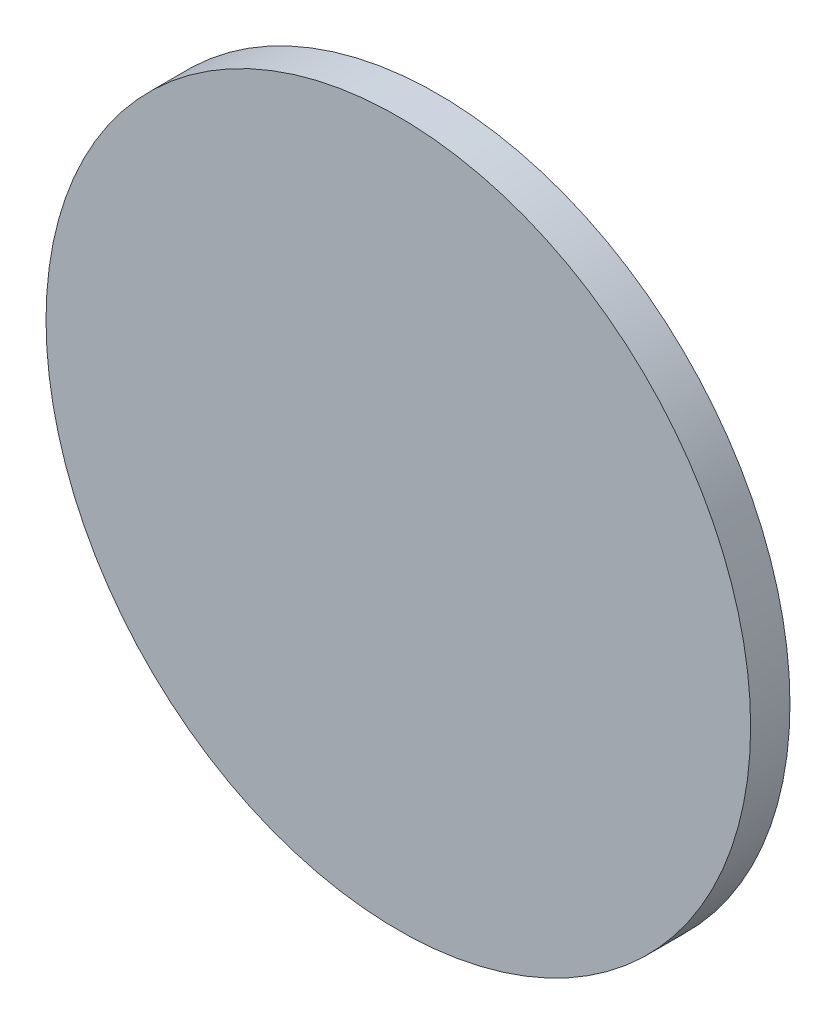
ISO-10303-21;
HEADER;
FILE_DESCRIPTION(('STEP AP214'),'2;1');
FILE_NAME('part.step','',(''),(''),'','','');
FILE_SCHEMA(('AUTOMOTIVE_DESIGN { 1 0 10303 214 1 1 1 1 }'));
ENDSEC;
DATA;
#1=APPLICATION_CONTEXT('core data for automotive mechanical design processes');
#2=APPLICATION_PROTOCOL_DEFINITION('international standard','automotive_design',2000,#1);
#3=PRODUCT_CONTEXT('',#1,'mechanical');
#4=PRODUCT('Part','Part','',(#3));
#5=PRODUCT_RELATED_PRODUCT_CATEGORY('part','',(#4));
#6=PRODUCT_DEFINITION_FORMATION('','',#4);
#7=PRODUCT_DEFINITION_CONTEXT('part definition',#1,'design');
#8=PRODUCT_DEFINITION('design','',#6,#7);
#9=PRODUCT_DEFINITION_SHAPE('','',#8);
#10=(LENGTH_UNIT() NAMED_UNIT(*) SI_UNIT(.MILLI.,.METRE.));
#11=(NAMED_UNIT(*) PLANE_ANGLE_UNIT() SI_UNIT($,.RADIAN.));
#12=(NAMED_UNIT(*) SI_UNIT($,.STERADIAN.) SOLID_ANGLE_UNIT());
#13=UNCERTAINTY_MEASURE_WITH_UNIT(LENGTH_MEASURE(1.E-05),#10,'distance_accuracy_value','');
#14=(GEOMETRIC_REPRESENTATION_CONTEXT(3) GLOBAL_UNCERTAINTY_ASSIGNED_CONTEXT((#13)) GLOBAL_UNIT_ASSIGNED_CONTEXT((#10,
#11,#12)) REPRESENTATION_CONTEXT('',''));
#15=CARTESIAN_POINT('',(0.,0.,0.));
#16=DIRECTION('',(0.,0.,1.));
#17=DIRECTION('',(1.,0.,0.));
#18=AXIS2_PLACEMENT_3D('',#15,#16,#17);
#19=CARTESIAN_POINT('',(0.,0.,2.54));
#20=DIRECTION('',(0.,0.,-1.));
#21=DIRECTION('',(-1.,0.,0.));
#22=AXIS2_PLACEMENT_3D('',#19,#20,#21);
#23=CYLINDRICAL_SURFACE('',#22,22.75);
#24=CARTESIAN_POINT('',(0.,0.,2.54));
#25=DIRECTION('',(0.,0.,1.));
#26=DIRECTION('',(1.,0.,0.));
#27=AXIS2_PLACEMENT_3D('',#24,#25,#26);
#28=CIRCLE('',#27,22.75);
#29=CARTESIAN_POINT('',(22.75,0.,2.54));
#30=VERTEX_POINT('',#29);
#31=EDGE_CURVE('E10',#30,#30,#28,.T.);
#32=ORIENTED_EDGE('',*,*,#31,.F.);
#33=EDGE_LOOP('',(#32));
#34=FACE_BOUND('',#33,.T.);
#35=CARTESIAN_POINT('',(0.,0.,0.));
#36=DIRECTION('',(0.,0.,1.));
#37=DIRECTION('',(1.,0.,0.));
#38=AXIS2_PLACEMENT_3D('',#35,#36,#37);
#39=CIRCLE('',#38,22.75);
#40=CARTESIAN_POINT('',(22.75,0.,0.));
#41=VERTEX_POINT('',#40);
#42=EDGE_CURVE('E40',#41,#41,#39,.T.);
#43=ORIENTED_EDGE('',*,*,#42,.T.);
#44=EDGE_LOOP('',(#43));
#45=FACE_BOUND('',#44,.T.);
#46=ADVANCED_FACE('F37',(#34,#45),#23,.T.);
#47=CARTESIAN_POINT('',(0.,0.,2.54));
#48=DIRECTION('',(0.,0.,1.));
#49=DIRECTION('',(1.,0.,0.));
#50=AXIS2_PLACEMENT_3D('',#47,#48,#49);
#51=PLANE('',#50);
#52=ORIENTED_EDGE('',*,*,#31,.T.);
#53=EDGE_LOOP('',(#52));
#54=FACE_BOUND('',#53,.T.);
#55=ADVANCED_FACE('F54',(#54),#51,.T.);
#56=CARTESIAN_POINT('',(0.,0.,0.));
#57=DIRECTION('',(0.,0.,1.));
#58=DIRECTION('',(1.,0.,0.));
#59=AXIS2_PLACEMENT_3D('',#56,#57,#58);
#60=PLANE('',#59);
#61=ORIENTED_EDGE('',*,*,#42,.F.);
#62=EDGE_LOOP('',(#61));
#63=FACE_BOUND('',#62,.T.);
#64=ADVANCED_FACE('F52',(#63),#60,.F.);
#65=CLOSED_SHELL('',(#46,#55,#64));
#66=MANIFOLD_SOLID_BREP('B2',#65);
#67=ADVANCED_BREP_SHAPE_REPRESENTATION('',(#18,#66),#14);
#68=SHAPE_DEFINITION_REPRESENTATION(#9,#67);
ENDSEC;
END-ISO-10303-21;
